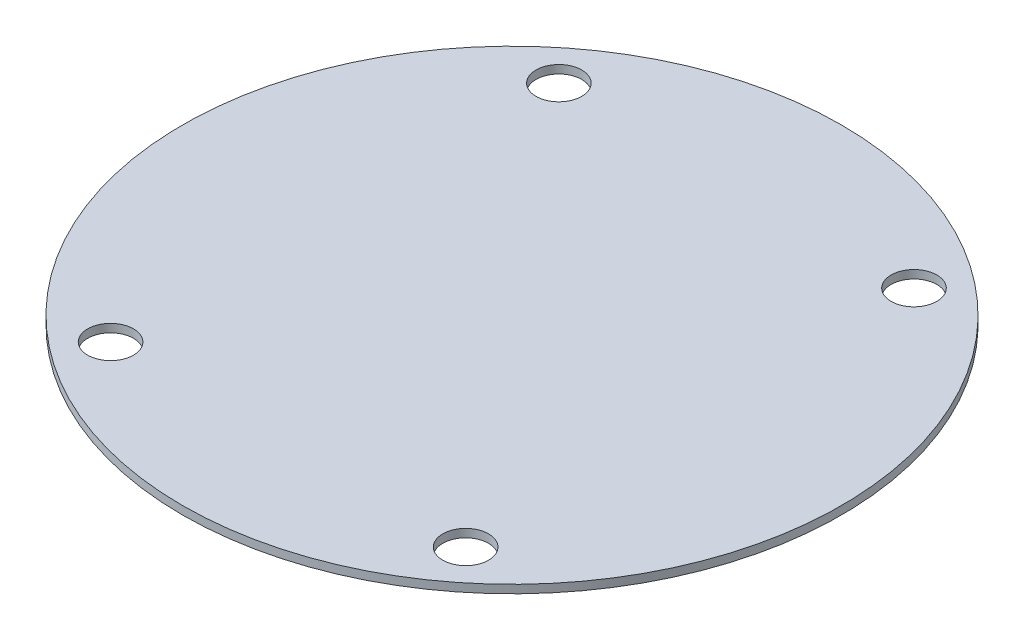
ISO-10303-21;
HEADER;
FILE_DESCRIPTION(('STEP AP214'),'2;1');
FILE_NAME('part.step','',(''),(''),'','','');
FILE_SCHEMA(('AUTOMOTIVE_DESIGN { 1 0 10303 214 1 1 1 1 }'));
ENDSEC;
DATA;
#1=APPLICATION_CONTEXT('core data for automotive mechanical design processes');
#2=APPLICATION_PROTOCOL_DEFINITION('international standard','automotive_design',2000,#1);
#3=PRODUCT_CONTEXT('',#1,'mechanical');
#4=PRODUCT('Part','Part','',(#3));
#5=PRODUCT_RELATED_PRODUCT_CATEGORY('part','',(#4));
#6=PRODUCT_DEFINITION_FORMATION('','',#4);
#7=PRODUCT_DEFINITION_CONTEXT('part definition',#1,'design');
#8=PRODUCT_DEFINITION('design','',#6,#7);
#9=PRODUCT_DEFINITION_SHAPE('','',#8);
#10=(LENGTH_UNIT() NAMED_UNIT(*) SI_UNIT(.MILLI.,.METRE.));
#11=(NAMED_UNIT(*) PLANE_ANGLE_UNIT() SI_UNIT($,.RADIAN.));
#12=(NAMED_UNIT(*) SI_UNIT($,.STERADIAN.) SOLID_ANGLE_UNIT());
#13=UNCERTAINTY_MEASURE_WITH_UNIT(LENGTH_MEASURE(1.E-05),#10,'distance_accuracy_value','');
#14=(GEOMETRIC_REPRESENTATION_CONTEXT(3) GLOBAL_UNCERTAINTY_ASSIGNED_CONTEXT((#13)) GLOBAL_UNIT_ASSIGNED_CONTEXT((#10,
#11,#12)) REPRESENTATION_CONTEXT('',''));
#15=CARTESIAN_POINT('',(0.,0.,0.));
#16=DIRECTION('',(0.,0.,1.));
#17=DIRECTION('',(1.,0.,0.));
#18=AXIS2_PLACEMENT_3D('',#15,#16,#17);
#19=CARTESIAN_POINT('',(0.,1.,0.));
#20=DIRECTION('',(0.,-1.,0.));
#21=DIRECTION('',(0.,0.,-1.));
#22=AXIS2_PLACEMENT_3D('',#19,#20,#21);
#23=CYLINDRICAL_SURFACE('',#22,40.);
#24=CARTESIAN_POINT('',(0.,1.,0.));
#25=DIRECTION('',(0.,1.,0.));
#26=DIRECTION('',(0.,0.,1.));
#27=AXIS2_PLACEMENT_3D('',#24,#25,#26);
#28=CIRCLE('',#27,40.);
#29=CARTESIAN_POINT('',(0.,1.,40.));
#30=VERTEX_POINT('',#29);
#31=EDGE_CURVE('E10',#30,#30,#28,.T.);
#32=ORIENTED_EDGE('',*,*,#31,.F.);
#33=EDGE_LOOP('',(#32));
#34=FACE_BOUND('',#33,.T.);
#35=CARTESIAN_POINT('',(0.,0.,0.));
#36=DIRECTION('',(0.,1.,0.));
#37=DIRECTION('',(0.,0.,1.));
#38=AXIS2_PLACEMENT_3D('',#35,#36,#37);
#39=CIRCLE('',#38,40.);
#40=CARTESIAN_POINT('',(0.,0.,40.));
#41=VERTEX_POINT('',#40);
#42=EDGE_CURVE('E37',#41,#41,#39,.T.);
#43=ORIENTED_EDGE('',*,*,#42,.T.);
#44=EDGE_LOOP('',(#43));
#45=FACE_BOUND('',#44,.T.);
#46=ADVANCED_FACE('F40',(#34,#45),#23,.T.);
#47=CARTESIAN_POINT('',(0.,1.,0.));
#48=DIRECTION('',(0.,1.,0.));
#49=DIRECTION('',(0.,0.,1.));
#50=AXIS2_PLACEMENT_3D('',#47,#48,#49);
#51=PLANE('',#50);
#52=CARTESIAN_POINT('',(21.55,1.,27.1741919643987));
#53=DIRECTION('',(0.,-1.,0.));
#54=DIRECTION('',(0.,0.,-1.));
#55=AXIS2_PLACEMENT_3D('',#52,#53,#54);
#56=CIRCLE('',#55,2.775);
#57=CARTESIAN_POINT('',(21.55,1.,24.3991919643987));
#58=VERTEX_POINT('',#57);
#59=EDGE_CURVE('E61',#58,#58,#56,.T.);
#60=ORIENTED_EDGE('',*,*,#59,.T.);
#61=EDGE_LOOP('',(#60));
#62=FACE_BOUND('',#61,.T.);
#63=CARTESIAN_POINT('',(-21.55,1.,-27.2409321928339));
#64=DIRECTION('',(0.,-1.,0.));
#65=DIRECTION('',(0.,0.,-1.));
#66=AXIS2_PLACEMENT_3D('',#63,#64,#65);
#67=CIRCLE('',#66,2.775);
#68=CARTESIAN_POINT('',(-21.55,1.,-30.0159321928339));
#69=VERTEX_POINT('',#68);
#70=EDGE_CURVE('E54',#69,#69,#67,.T.);
#71=ORIENTED_EDGE('',*,*,#70,.T.);
#72=EDGE_LOOP('',(#71));
#73=FACE_BOUND('',#72,.T.);
#74=CARTESIAN_POINT('',(21.55,1.,-27.2409321928339));
#75=DIRECTION('',(0.,-1.,0.));
#76=DIRECTION('',(0.,0.,-1.));
#77=AXIS2_PLACEMENT_3D('',#74,#75,#76);
#78=CIRCLE('',#77,2.775);
#79=CARTESIAN_POINT('',(21.55,1.,-30.0159321928339));
#80=VERTEX_POINT('',#79);
#81=EDGE_CURVE('E70',#80,#80,#78,.T.);
#82=ORIENTED_EDGE('',*,*,#81,.T.);
#83=EDGE_LOOP('',(#82));
#84=FACE_BOUND('',#83,.T.);
#85=CARTESIAN_POINT('',(-21.55,1.,27.1741919643987));
#86=DIRECTION('',(0.,-1.,0.));
#87=DIRECTION('',(0.,0.,-1.));
#88=AXIS2_PLACEMENT_3D('',#85,#86,#87);
#89=CIRCLE('',#88,2.775);
#90=CARTESIAN_POINT('',(-21.55,1.,24.3991919643987));
#91=VERTEX_POINT('',#90);
#92=EDGE_CURVE('E50',#91,#91,#89,.T.);
#93=ORIENTED_EDGE('',*,*,#92,.T.);
#94=EDGE_LOOP('',(#93));
#95=FACE_BOUND('',#94,.T.);
#96=ORIENTED_EDGE('',*,*,#31,.T.);
#97=EDGE_LOOP('',(#96));
#98=FACE_BOUND('',#97,.T.);
#99=ADVANCED_FACE('F78',(#62,#73,#84,#95,#98),#51,.T.);
#100=CARTESIAN_POINT('',(0.,0.,0.));
#101=DIRECTION('',(0.,1.,0.));
#102=DIRECTION('',(0.,0.,1.));
#103=AXIS2_PLACEMENT_3D('',#100,#101,#102);
#104=PLANE('',#103);
#105=CARTESIAN_POINT('',(21.55,0.,27.1741919643987));
#106=DIRECTION('',(0.,-1.,0.));
#107=DIRECTION('',(0.,0.,-1.));
#108=AXIS2_PLACEMENT_3D('',#105,#106,#107);
#109=CIRCLE('',#108,2.775);
#110=CARTESIAN_POINT('',(21.55,0.,24.3991919643987));
#111=VERTEX_POINT('',#110);
#112=EDGE_CURVE('E55',#111,#111,#109,.T.);
#113=ORIENTED_EDGE('',*,*,#112,.F.);
#114=EDGE_LOOP('',(#113));
#115=FACE_BOUND('',#114,.T.);
#116=CARTESIAN_POINT('',(-21.55,0.,-27.2409321928339));
#117=DIRECTION('',(0.,-1.,0.));
#118=DIRECTION('',(0.,0.,-1.));
#119=AXIS2_PLACEMENT_3D('',#116,#117,#118);
#120=CIRCLE('',#119,2.775);
#121=CARTESIAN_POINT('',(-21.55,0.,-30.0159321928339));
#122=VERTEX_POINT('',#121);
#123=EDGE_CURVE('E59',#122,#122,#120,.T.);
#124=ORIENTED_EDGE('',*,*,#123,.F.);
#125=EDGE_LOOP('',(#124));
#126=FACE_BOUND('',#125,.T.);
#127=CARTESIAN_POINT('',(21.55,0.,-27.2409321928339));
#128=DIRECTION('',(0.,-1.,0.));
#129=DIRECTION('',(0.,0.,-1.));
#130=AXIS2_PLACEMENT_3D('',#127,#128,#129);
#131=CIRCLE('',#130,2.775);
#132=CARTESIAN_POINT('',(21.55,0.,-30.0159321928339));
#133=VERTEX_POINT('',#132);
#134=EDGE_CURVE('E56',#133,#133,#131,.T.);
#135=ORIENTED_EDGE('',*,*,#134,.F.);
#136=EDGE_LOOP('',(#135));
#137=FACE_BOUND('',#136,.T.);
#138=CARTESIAN_POINT('',(-21.55,0.,27.1741919643987));
#139=DIRECTION('',(0.,-1.,0.));
#140=DIRECTION('',(0.,0.,-1.));
#141=AXIS2_PLACEMENT_3D('',#138,#139,#140);
#142=CIRCLE('',#141,2.775);
#143=CARTESIAN_POINT('',(-21.55,0.,24.3991919643987));
#144=VERTEX_POINT('',#143);
#145=EDGE_CURVE('E47',#144,#144,#142,.T.);
#146=ORIENTED_EDGE('',*,*,#145,.F.);
#147=EDGE_LOOP('',(#146));
#148=FACE_BOUND('',#147,.T.);
#149=ORIENTED_EDGE('',*,*,#42,.F.);
#150=EDGE_LOOP('',(#149));
#151=FACE_BOUND('',#150,.T.);
#152=ADVANCED_FACE('F73',(#115,#126,#137,#148,#151),#104,.F.);
#153=CARTESIAN_POINT('',(-21.55,1.,27.1741919643987));
#154=DIRECTION('',(0.,-1.,0.));
#155=DIRECTION('',(0.,0.,-1.));
#156=AXIS2_PLACEMENT_3D('',#153,#154,#155);
#157=CYLINDRICAL_SURFACE('',#156,2.775);
#158=ORIENTED_EDGE('',*,*,#92,.F.);
#159=EDGE_LOOP('',(#158));
#160=FACE_BOUND('',#159,.T.);
#161=ORIENTED_EDGE('',*,*,#145,.T.);
#162=EDGE_LOOP('',(#161));
#163=FACE_BOUND('',#162,.T.);
#164=ADVANCED_FACE('F80',(#160,#163),#157,.F.);
#165=CARTESIAN_POINT('',(21.55,1.,-27.2409321928339));
#166=DIRECTION('',(0.,-1.,0.));
#167=DIRECTION('',(0.,0.,-1.));
#168=AXIS2_PLACEMENT_3D('',#165,#166,#167);
#169=CYLINDRICAL_SURFACE('',#168,2.775);
#170=ORIENTED_EDGE('',*,*,#81,.F.);
#171=EDGE_LOOP('',(#170));
#172=FACE_BOUND('',#171,.T.);
#173=ORIENTED_EDGE('',*,*,#134,.T.);
#174=EDGE_LOOP('',(#173));
#175=FACE_BOUND('',#174,.T.);
#176=ADVANCED_FACE('F71',(#172,#175),#169,.F.);
#177=CARTESIAN_POINT('',(-21.55,1.,-27.2409321928339));
#178=DIRECTION('',(0.,-1.,0.));
#179=DIRECTION('',(0.,0.,-1.));
#180=AXIS2_PLACEMENT_3D('',#177,#178,#179);
#181=CYLINDRICAL_SURFACE('',#180,2.775);
#182=ORIENTED_EDGE('',*,*,#70,.F.);
#183=EDGE_LOOP('',(#182));
#184=FACE_BOUND('',#183,.T.);
#185=ORIENTED_EDGE('',*,*,#123,.T.);
#186=EDGE_LOOP('',(#185));
#187=FACE_BOUND('',#186,.T.);
#188=ADVANCED_FACE('F97',(#184,#187),#181,.F.);
#189=CARTESIAN_POINT('',(21.55,1.,27.1741919643987));
#190=DIRECTION('',(0.,-1.,0.));
#191=DIRECTION('',(0.,0.,-1.));
#192=AXIS2_PLACEMENT_3D('',#189,#190,#191);
#193=CYLINDRICAL_SURFACE('',#192,2.775);
#194=ORIENTED_EDGE('',*,*,#59,.F.);
#195=EDGE_LOOP('',(#194));
#196=FACE_BOUND('',#195,.T.);
#197=ORIENTED_EDGE('',*,*,#112,.T.);
#198=EDGE_LOOP('',(#197));
#199=FACE_BOUND('',#198,.T.);
#200=ADVANCED_FACE('F105',(#196,#199),#193,.F.);
#201=CLOSED_SHELL('',(#46,#99,#152,#164,#176,#188,#200));
#202=MANIFOLD_SOLID_BREP('B2',#201);
#203=ADVANCED_BREP_SHAPE_REPRESENTATION('',(#18,#202),#14);
#204=SHAPE_DEFINITION_REPRESENTATION(#9,#203);
ENDSEC;
END-ISO-10303-21;
